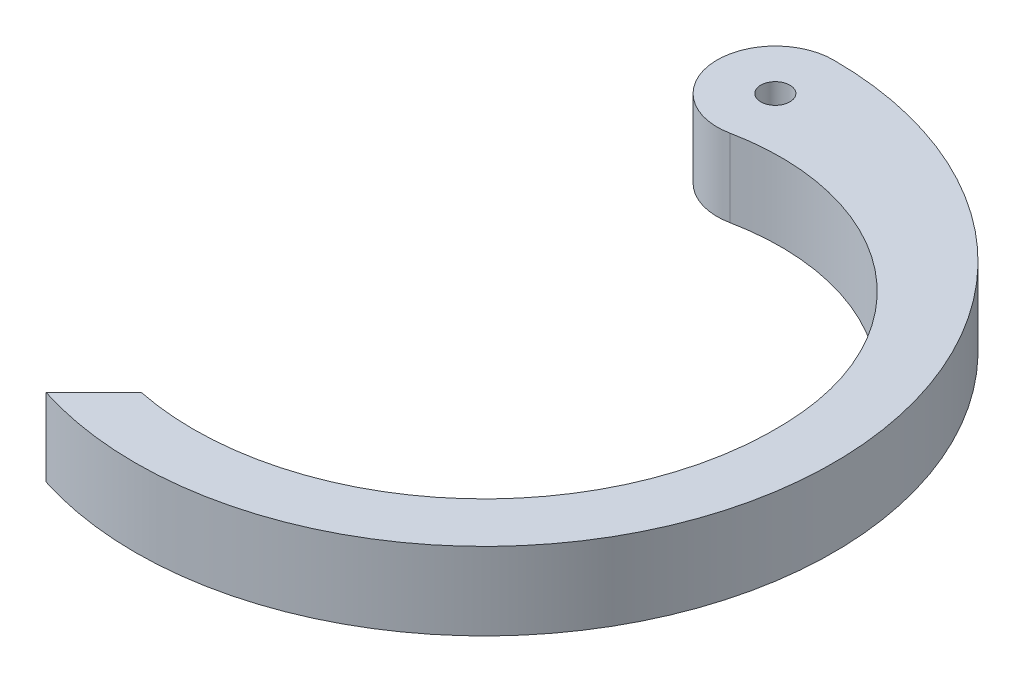
ISO-10303-21;
HEADER;
FILE_DESCRIPTION(('STEP AP214'),'2;1');
FILE_NAME('part.step','',(''),(''),'','','');
FILE_SCHEMA(('AUTOMOTIVE_DESIGN { 1 0 10303 214 1 1 1 1 }'));
ENDSEC;
DATA;
#1=APPLICATION_CONTEXT('core data for automotive mechanical design processes');
#2=APPLICATION_PROTOCOL_DEFINITION('international standard','automotive_design',2000,#1);
#3=PRODUCT_CONTEXT('',#1,'mechanical');
#4=PRODUCT('Part','Part','',(#3));
#5=PRODUCT_RELATED_PRODUCT_CATEGORY('part','',(#4));
#6=PRODUCT_DEFINITION_FORMATION('','',#4);
#7=PRODUCT_DEFINITION_CONTEXT('part definition',#1,'design');
#8=PRODUCT_DEFINITION('design','',#6,#7);
#9=PRODUCT_DEFINITION_SHAPE('','',#8);
#10=(LENGTH_UNIT() NAMED_UNIT(*) SI_UNIT(.MILLI.,.METRE.));
#11=(NAMED_UNIT(*) PLANE_ANGLE_UNIT() SI_UNIT($,.RADIAN.));
#12=(NAMED_UNIT(*) SI_UNIT($,.STERADIAN.) SOLID_ANGLE_UNIT());
#13=UNCERTAINTY_MEASURE_WITH_UNIT(LENGTH_MEASURE(1.E-05),#10,'distance_accuracy_value','');
#14=(GEOMETRIC_REPRESENTATION_CONTEXT(3) GLOBAL_UNCERTAINTY_ASSIGNED_CONTEXT((#13)) GLOBAL_UNIT_ASSIGNED_CONTEXT((#10,
#11,#12)) REPRESENTATION_CONTEXT('',''));
#15=CARTESIAN_POINT('',(0.,0.,0.));
#16=DIRECTION('',(0.,0.,1.));
#17=DIRECTION('',(1.,0.,0.));
#18=AXIS2_PLACEMENT_3D('',#15,#16,#17);
#19=CARTESIAN_POINT('',(0.,12.7,47.625));
#20=DIRECTION('',(0.,-1.,0.));
#21=DIRECTION('',(0.,0.,-1.));
#22=AXIS2_PLACEMENT_3D('',#19,#20,#21);
#23=CYLINDRICAL_SURFACE('',#22,57.15);
#24=CARTESIAN_POINT('',(0.,0.,47.625));
#25=DIRECTION('',(0.,1.,0.));
#26=DIRECTION('',(0.,0.,1.));
#27=AXIS2_PLACEMENT_3D('',#24,#25,#26);
#28=CIRCLE('',#27,57.15);
#29=CARTESIAN_POINT('',(-17.3234155257155,0.,102.086195125735));
#30=VERTEX_POINT('',#29);
#31=CARTESIAN_POINT('',(0.,0.,-9.525));
#32=VERTEX_POINT('',#31);
#33=EDGE_CURVE('E112',#30,#32,#28,.T.);
#34=ORIENTED_EDGE('',*,*,#33,.T.);
#35=DIRECTION('',(0.,-1.,0.));
#36=VECTOR('',#35,1.);
#37=CARTESIAN_POINT('',(0.,12.7,-9.525));
#38=LINE('',#37,#36);
#39=CARTESIAN_POINT('',(0.,12.7,-9.525));
#40=VERTEX_POINT('',#39);
#41=EDGE_CURVE('E11',#40,#32,#38,.T.);
#42=ORIENTED_EDGE('',*,*,#41,.F.);
#43=CARTESIAN_POINT('',(0.,12.7,47.625));
#44=DIRECTION('',(0.,1.,0.));
#45=DIRECTION('',(0.,0.,1.));
#46=AXIS2_PLACEMENT_3D('',#43,#44,#45);
#47=CIRCLE('',#46,57.15);
#48=CARTESIAN_POINT('',(-17.3234155257155,12.7,102.086195125735));
#49=VERTEX_POINT('',#48);
#50=EDGE_CURVE('E125',#49,#40,#47,.T.);
#51=ORIENTED_EDGE('',*,*,#50,.F.);
#52=DIRECTION('',(0.,-1.,0.));
#53=VECTOR('',#52,1.);
#54=CARTESIAN_POINT('',(-17.3234155257155,12.7,102.086195125735));
#55=LINE('',#54,#53);
#56=EDGE_CURVE('E49',#49,#30,#55,.T.);
#57=ORIENTED_EDGE('',*,*,#56,.T.);
#58=EDGE_LOOP('',(#34,#42,#51,#57));
#59=FACE_BOUND('',#58,.T.);
#60=ADVANCED_FACE('F33',(#59),#23,.T.);
#61=CARTESIAN_POINT('',(0.,12.7,0.));
#62=DIRECTION('',(0.,-1.,0.));
#63=DIRECTION('',(0.,0.,-1.));
#64=AXIS2_PLACEMENT_3D('',#61,#62,#63);
#65=CYLINDRICAL_SURFACE('',#64,9.525);
#66=CARTESIAN_POINT('',(0.,0.,0.));
#67=DIRECTION('',(0.,1.,0.));
#68=DIRECTION('',(0.,0.,1.));
#69=AXIS2_PLACEMENT_3D('',#66,#67,#68);
#70=CIRCLE('',#69,9.525);
#71=CARTESIAN_POINT('',(1.89545106768812,0.,9.3345));
#72=VERTEX_POINT('',#71);
#73=EDGE_CURVE('E114',#32,#72,#70,.T.);
#74=ORIENTED_EDGE('',*,*,#73,.T.);
#75=DIRECTION('',(0.,-1.,0.));
#76=VECTOR('',#75,1.);
#77=CARTESIAN_POINT('',(1.89545106768812,12.7,9.3345));
#78=LINE('',#77,#76);
#79=CARTESIAN_POINT('',(1.89545106768812,12.7,9.3345));
#80=VERTEX_POINT('',#79);
#81=EDGE_CURVE('E41',#80,#72,#78,.T.);
#82=ORIENTED_EDGE('',*,*,#81,.F.);
#83=CARTESIAN_POINT('',(0.,12.7,0.));
#84=DIRECTION('',(0.,1.,0.));
#85=DIRECTION('',(0.,0.,1.));
#86=AXIS2_PLACEMENT_3D('',#83,#84,#85);
#87=CIRCLE('',#86,9.525);
#88=EDGE_CURVE('E78',#40,#80,#87,.T.);
#89=ORIENTED_EDGE('',*,*,#88,.F.);
#90=ORIENTED_EDGE('',*,*,#41,.T.);
#91=EDGE_LOOP('',(#74,#82,#89,#90));
#92=FACE_BOUND('',#91,.T.);
#93=ADVANCED_FACE('F142',(#92),#65,.T.);
#94=CARTESIAN_POINT('',(9.47725533844057,12.7,46.6725));
#95=DIRECTION('',(0.,-1.,0.));
#96=DIRECTION('',(0.,0.,-1.));
#97=AXIS2_PLACEMENT_3D('',#94,#95,#96);
#98=CYLINDRICAL_SURFACE('',#97,38.1);
#99=CARTESIAN_POINT('',(9.47725533844057,0.,46.6725));
#100=DIRECTION('',(0.,1.,0.));
#101=DIRECTION('',(0.,0.,1.));
#102=AXIS2_PLACEMENT_3D('',#99,#100,#101);
#103=CIRCLE('',#102,38.1);
#104=CARTESIAN_POINT('',(47.3862766922028,0.,42.8625));
#105=VERTEX_POINT('',#104);
#106=EDGE_CURVE('E99',#72,#105,#103,.F.);
#107=ORIENTED_EDGE('',*,*,#106,.T.);
#108=DIRECTION('',(0.,-1.,0.));
#109=VECTOR('',#108,1.);
#110=CARTESIAN_POINT('',(47.3862766922028,12.7,42.8625));
#111=LINE('',#110,#109);
#112=CARTESIAN_POINT('',(47.3862766922028,12.7,42.8625));
#113=VERTEX_POINT('',#112);
#114=EDGE_CURVE('E96',#113,#105,#111,.T.);
#115=ORIENTED_EDGE('',*,*,#114,.F.);
#116=CARTESIAN_POINT('',(9.47725533844057,12.7,46.6725));
#117=DIRECTION('',(0.,1.,0.));
#118=DIRECTION('',(0.,0.,1.));
#119=AXIS2_PLACEMENT_3D('',#116,#117,#118);
#120=CIRCLE('',#119,38.1);
#121=EDGE_CURVE('E85',#80,#113,#120,.F.);
#122=ORIENTED_EDGE('',*,*,#121,.F.);
#123=ORIENTED_EDGE('',*,*,#81,.T.);
#124=EDGE_LOOP('',(#107,#115,#122,#123));
#125=FACE_BOUND('',#124,.T.);
#126=ADVANCED_FACE('F97',(#125),#98,.F.);
#127=CARTESIAN_POINT('',(0.,12.7,47.625));
#128=DIRECTION('',(0.,-1.,0.));
#129=DIRECTION('',(0.,0.,-1.));
#130=AXIS2_PLACEMENT_3D('',#127,#128,#129);
#131=CYLINDRICAL_SURFACE('',#130,47.625);
#132=CARTESIAN_POINT('',(0.,0.,47.625));
#133=DIRECTION('',(0.,1.,0.));
#134=DIRECTION('',(0.,0.,1.));
#135=AXIS2_PLACEMENT_3D('',#132,#133,#134);
#136=CIRCLE('',#135,47.625);
#137=CARTESIAN_POINT('',(-9.525,0.,94.2877796000195));
#138=VERTEX_POINT('',#137);
#139=EDGE_CURVE('E117',#138,#105,#136,.T.);
#140=ORIENTED_EDGE('',*,*,#139,.F.);
#141=DIRECTION('',(0.,-1.,0.));
#142=VECTOR('',#141,1.);
#143=CARTESIAN_POINT('',(-9.525,12.7,94.2877796000195));
#144=LINE('',#143,#142);
#145=CARTESIAN_POINT('',(-9.525,12.7,94.2877796000195));
#146=VERTEX_POINT('',#145);
#147=EDGE_CURVE('E66',#146,#138,#144,.T.);
#148=ORIENTED_EDGE('',*,*,#147,.F.);
#149=CARTESIAN_POINT('',(0.,12.7,47.625));
#150=DIRECTION('',(0.,1.,0.));
#151=DIRECTION('',(0.,0.,1.));
#152=AXIS2_PLACEMENT_3D('',#149,#150,#151);
#153=CIRCLE('',#152,47.625);
#154=EDGE_CURVE('E91',#146,#113,#153,.T.);
#155=ORIENTED_EDGE('',*,*,#154,.T.);
#156=ORIENTED_EDGE('',*,*,#114,.T.);
#157=EDGE_LOOP('',(#140,#148,#155,#156));
#158=FACE_BOUND('',#157,.T.);
#159=ADVANCED_FACE('F103',(#158),#131,.F.);
#160=CARTESIAN_POINT('',(42.3813898000097,12.7,42.3813898000092));
#161=DIRECTION('',(-0.707106781186552,0.,-0.707106781186543));
#162=DIRECTION('',(-0.707106781186543,0.,0.707106781186552));
#163=AXIS2_PLACEMENT_3D('',#160,#161,#162);
#164=PLANE('',#163);
#165=DIRECTION('',(0.707106781186543,0.,-0.707106781186552));
#166=VECTOR('',#165,1.);
#167=CARTESIAN_POINT('',(42.3813898000097,0.,42.3813898000092));
#168=LINE('',#167,#166);
#169=EDGE_CURVE('E119',#30,#138,#168,.T.);
#170=ORIENTED_EDGE('',*,*,#169,.F.);
#171=ORIENTED_EDGE('',*,*,#56,.F.);
#172=DIRECTION('',(0.707106781186543,0.,-0.707106781186552));
#173=VECTOR('',#172,1.);
#174=CARTESIAN_POINT('',(42.3813898000097,12.7,42.3813898000092));
#175=LINE('',#174,#173);
#176=EDGE_CURVE('E104',#49,#146,#175,.T.);
#177=ORIENTED_EDGE('',*,*,#176,.T.);
#178=ORIENTED_EDGE('',*,*,#147,.T.);
#179=EDGE_LOOP('',(#170,#171,#177,#178));
#180=FACE_BOUND('',#179,.T.);
#181=ADVANCED_FACE('F130',(#180),#164,.T.);
#182=CARTESIAN_POINT('',(0.,12.7,0.));
#183=DIRECTION('',(0.,-1.,0.));
#184=DIRECTION('',(0.,0.,-1.));
#185=AXIS2_PLACEMENT_3D('',#182,#183,#184);
#186=CYLINDRICAL_SURFACE('',#185,2.38125);
#187=CARTESIAN_POINT('',(0.,12.7,0.));
#188=DIRECTION('',(0.,1.,0.));
#189=DIRECTION('',(0.,0.,1.));
#190=AXIS2_PLACEMENT_3D('',#187,#188,#189);
#191=CIRCLE('',#190,2.38125);
#192=CARTESIAN_POINT('',(0.,12.7,2.38125));
#193=VERTEX_POINT('',#192);
#194=EDGE_CURVE('E106',#193,#193,#191,.T.);
#195=ORIENTED_EDGE('',*,*,#194,.T.);
#196=EDGE_LOOP('',(#195));
#197=FACE_BOUND('',#196,.T.);
#198=CARTESIAN_POINT('',(0.,0.,0.));
#199=DIRECTION('',(0.,1.,0.));
#200=DIRECTION('',(0.,0.,1.));
#201=AXIS2_PLACEMENT_3D('',#198,#199,#200);
#202=CIRCLE('',#201,2.38125);
#203=CARTESIAN_POINT('',(0.,0.,2.38125));
#204=VERTEX_POINT('',#203);
#205=EDGE_CURVE('E122',#204,#204,#202,.T.);
#206=ORIENTED_EDGE('',*,*,#205,.F.);
#207=EDGE_LOOP('',(#206));
#208=FACE_BOUND('',#207,.T.);
#209=ADVANCED_FACE('F132',(#197,#208),#186,.F.);
#210=CARTESIAN_POINT('',(0.,12.7,0.));
#211=DIRECTION('',(0.,1.,0.));
#212=DIRECTION('',(0.,0.,1.));
#213=AXIS2_PLACEMENT_3D('',#210,#211,#212);
#214=PLANE('',#213);
#215=ORIENTED_EDGE('',*,*,#50,.T.);
#216=ORIENTED_EDGE('',*,*,#88,.T.);
#217=ORIENTED_EDGE('',*,*,#121,.T.);
#218=ORIENTED_EDGE('',*,*,#154,.F.);
#219=ORIENTED_EDGE('',*,*,#176,.F.);
#220=EDGE_LOOP('',(#215,#216,#217,#218,#219));
#221=FACE_BOUND('',#220,.T.);
#222=ORIENTED_EDGE('',*,*,#194,.F.);
#223=EDGE_LOOP('',(#222));
#224=FACE_BOUND('',#223,.T.);
#225=ADVANCED_FACE('F87',(#221,#224),#214,.T.);
#226=CARTESIAN_POINT('',(0.,0.,0.));
#227=DIRECTION('',(0.,1.,0.));
#228=DIRECTION('',(0.,0.,1.));
#229=AXIS2_PLACEMENT_3D('',#226,#227,#228);
#230=PLANE('',#229);
#231=ORIENTED_EDGE('',*,*,#33,.F.);
#232=ORIENTED_EDGE('',*,*,#169,.T.);
#233=ORIENTED_EDGE('',*,*,#139,.T.);
#234=ORIENTED_EDGE('',*,*,#106,.F.);
#235=ORIENTED_EDGE('',*,*,#73,.F.);
#236=EDGE_LOOP('',(#231,#232,#233,#234,#235));
#237=FACE_BOUND('',#236,.T.);
#238=ORIENTED_EDGE('',*,*,#205,.T.);
#239=EDGE_LOOP('',(#238));
#240=FACE_BOUND('',#239,.T.);
#241=ADVANCED_FACE('F128',(#237,#240),#230,.F.);
#242=CLOSED_SHELL('',(#60,#93,#126,#159,#181,#209,#225,#241));
#243=MANIFOLD_SOLID_BREP('B2',#242);
#244=ADVANCED_BREP_SHAPE_REPRESENTATION('',(#18,#243),#14);
#245=SHAPE_DEFINITION_REPRESENTATION(#9,#244);
ENDSEC;
END-ISO-10303-21;
